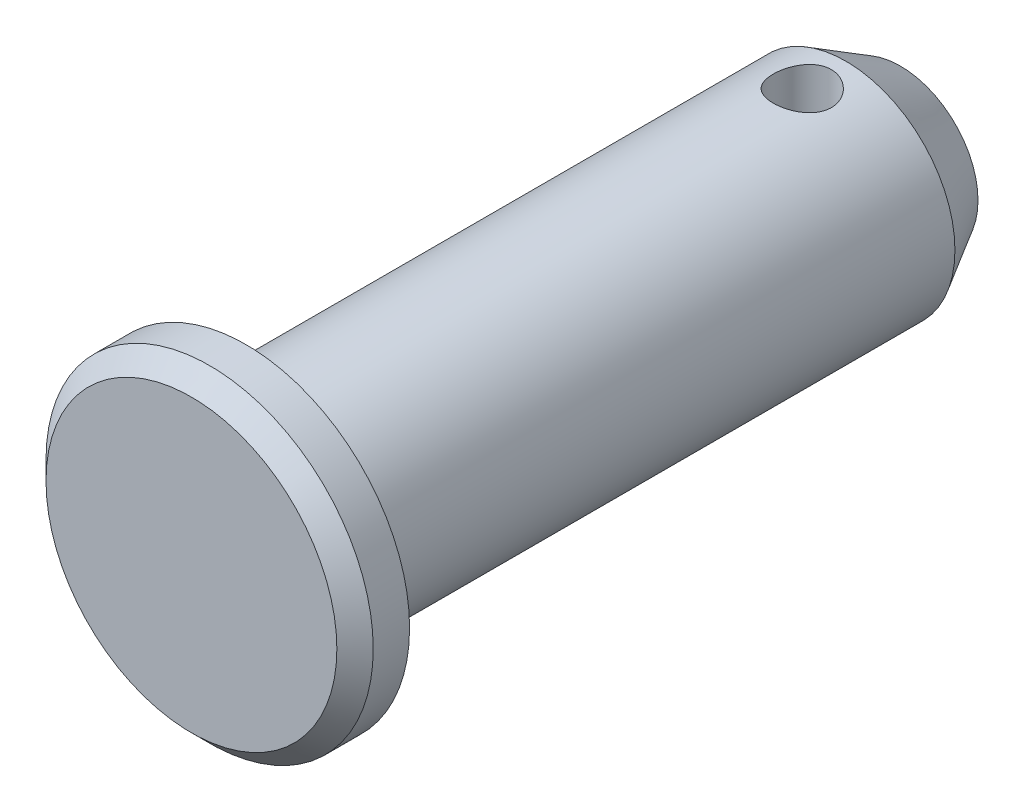
ISO-10303-21;
HEADER;
FILE_DESCRIPTION(('STEP AP214'),'2;1');
FILE_NAME('part.step','',(''),(''),'','','');
FILE_SCHEMA(('AUTOMOTIVE_DESIGN { 1 0 10303 214 1 1 1 1 }'));
ENDSEC;
DATA;
#1=APPLICATION_CONTEXT('core data for automotive mechanical design processes');
#2=APPLICATION_PROTOCOL_DEFINITION('international standard','automotive_design',2000,#1);
#3=PRODUCT_CONTEXT('',#1,'mechanical');
#4=PRODUCT('Part','Part','',(#3));
#5=PRODUCT_RELATED_PRODUCT_CATEGORY('part','',(#4));
#6=PRODUCT_DEFINITION_FORMATION('','',#4);
#7=PRODUCT_DEFINITION_CONTEXT('part definition',#1,'design');
#8=PRODUCT_DEFINITION('design','',#6,#7);
#9=PRODUCT_DEFINITION_SHAPE('','',#8);
#10=(LENGTH_UNIT() NAMED_UNIT(*) SI_UNIT(.MILLI.,.METRE.));
#11=(NAMED_UNIT(*) PLANE_ANGLE_UNIT() SI_UNIT($,.RADIAN.));
#12=(NAMED_UNIT(*) SI_UNIT($,.STERADIAN.) SOLID_ANGLE_UNIT());
#13=UNCERTAINTY_MEASURE_WITH_UNIT(LENGTH_MEASURE(1.E-05),#10,'distance_accuracy_value','');
#14=(GEOMETRIC_REPRESENTATION_CONTEXT(3) GLOBAL_UNCERTAINTY_ASSIGNED_CONTEXT((#13)) GLOBAL_UNIT_ASSIGNED_CONTEXT((#10,
#11,#12)) REPRESENTATION_CONTEXT('',''));
#15=CARTESIAN_POINT('',(0.,0.,0.));
#16=DIRECTION('',(0.,0.,1.));
#17=DIRECTION('',(1.,0.,0.));
#18=AXIS2_PLACEMENT_3D('',#15,#16,#17);
#19=CARTESIAN_POINT('',(0.,0.,9.75));
#20=DIRECTION('',(0.,0.,-1.));
#21=DIRECTION('',(-1.,0.,0.));
#22=AXIS2_PLACEMENT_3D('',#19,#20,#21);
#23=PLANE('',#22);
#24=CARTESIAN_POINT('',(0.,0.,9.75));
#25=DIRECTION('',(0.,0.,1.));
#26=DIRECTION('',(1.,0.,0.));
#27=AXIS2_PLACEMENT_3D('',#24,#25,#26);
#28=CIRCLE('',#27,4.);
#29=CARTESIAN_POINT('',(4.,0.,9.75));
#30=VERTEX_POINT('',#29);
#31=EDGE_CURVE('E10',#30,#30,#28,.T.);
#32=ORIENTED_EDGE('',*,*,#31,.T.);
#33=EDGE_LOOP('',(#32));
#34=FACE_BOUND('',#33,.T.);
#35=ADVANCED_FACE('F33',(#34),#23,.F.);
#36=CARTESIAN_POINT('',(0.,0.,9.25));
#37=DIRECTION('',(0.,0.,-1.));
#38=DIRECTION('',(-1.,0.,0.));
#39=AXIS2_PLACEMENT_3D('',#36,#37,#38);
#40=CONICAL_SURFACE('',#39,4.5,0.785398163397446);
#41=ORIENTED_EDGE('',*,*,#31,.F.);
#42=EDGE_LOOP('',(#41));
#43=FACE_BOUND('',#42,.T.);
#44=CARTESIAN_POINT('',(0.,0.,9.25));
#45=DIRECTION('',(0.,0.,1.));
#46=DIRECTION('',(1.,0.,0.));
#47=AXIS2_PLACEMENT_3D('',#44,#45,#46);
#48=CIRCLE('',#47,4.5);
#49=CARTESIAN_POINT('',(4.5,0.,9.25));
#50=VERTEX_POINT('',#49);
#51=EDGE_CURVE('E45',#50,#50,#48,.T.);
#52=ORIENTED_EDGE('',*,*,#51,.T.);
#53=EDGE_LOOP('',(#52));
#54=FACE_BOUND('',#53,.T.);
#55=ADVANCED_FACE('F82',(#43,#54),#40,.T.);
#56=CARTESIAN_POINT('',(0.,0.,9.75));
#57=DIRECTION('',(0.,0.,1.));
#58=DIRECTION('',(1.,0.,0.));
#59=AXIS2_PLACEMENT_3D('',#56,#57,#58);
#60=CYLINDRICAL_SURFACE('',#59,4.5);
#61=ORIENTED_EDGE('',*,*,#51,.F.);
#62=EDGE_LOOP('',(#61));
#63=FACE_BOUND('',#62,.T.);
#64=CARTESIAN_POINT('',(0.,0.,8.25));
#65=DIRECTION('',(0.,0.,1.));
#66=DIRECTION('',(1.,0.,0.));
#67=AXIS2_PLACEMENT_3D('',#64,#65,#66);
#68=CIRCLE('',#67,4.5);
#69=CARTESIAN_POINT('',(4.5,0.,8.25));
#70=VERTEX_POINT('',#69);
#71=EDGE_CURVE('E50',#70,#70,#68,.T.);
#72=ORIENTED_EDGE('',*,*,#71,.T.);
#73=EDGE_LOOP('',(#72));
#74=FACE_BOUND('',#73,.T.);
#75=ADVANCED_FACE('F86',(#63,#74),#60,.T.);
#76=CARTESIAN_POINT('',(0.,0.,8.25));
#77=DIRECTION('',(0.,0.,1.));
#78=DIRECTION('',(1.,0.,0.));
#79=AXIS2_PLACEMENT_3D('',#76,#77,#78);
#80=PLANE('',#79);
#81=ORIENTED_EDGE('',*,*,#71,.F.);
#82=EDGE_LOOP('',(#81));
#83=FACE_BOUND('',#82,.T.);
#84=CARTESIAN_POINT('',(0.,0.,8.25));
#85=DIRECTION('',(0.,0.,1.));
#86=DIRECTION('',(1.,0.,0.));
#87=AXIS2_PLACEMENT_3D('',#84,#85,#86);
#88=CIRCLE('',#87,3.);
#89=CARTESIAN_POINT('',(3.,0.,8.25));
#90=VERTEX_POINT('',#89);
#91=EDGE_CURVE('E103',#90,#90,#88,.T.);
#92=ORIENTED_EDGE('',*,*,#91,.T.);
#93=EDGE_LOOP('',(#92));
#94=FACE_BOUND('',#93,.T.);
#95=ADVANCED_FACE('F77',(#83,#94),#80,.F.);
#96=CARTESIAN_POINT('',(0.,0.,9.75));
#97=DIRECTION('',(0.,0.,1.));
#98=DIRECTION('',(1.,0.,0.));
#99=AXIS2_PLACEMENT_3D('',#96,#97,#98);
#100=CYLINDRICAL_SURFACE('',#99,3.);
#101=CARTESIAN_POINT('',(0.,-3.,-6.25));
#102=CARTESIAN_POINT('',(0.0441018223331417,-2.99999933524065,-6.25000104677394));
#103=CARTESIAN_POINT('',(0.0882148640887362,-2.99901794464862,-6.25365904567587));
#104=CARTESIAN_POINT('',(0.175170180541785,-2.99519829448663,-6.26816849229548));
#105=CARTESIAN_POINT('',(0.218011833327634,-2.9923591413303,-6.27902340177044));
#106=CARTESIAN_POINT('',(0.301156635618125,-2.98513733301121,-6.30754866674561));
#107=CARTESIAN_POINT('',(0.341462980406115,-2.98075666852169,-6.32521023506641));
#108=CARTESIAN_POINT('',(0.418541474557063,-2.97091479660652,-6.36681489706664));
#109=CARTESIAN_POINT('',(0.455313388179847,-2.96545351718002,-6.39075840934369));
#110=CARTESIAN_POINT('',(0.525131801496009,-2.95389845960869,-6.44483340656537));
#111=CARTESIAN_POINT('',(0.558084675945126,-2.9477938707174,-6.47508346720339));
#112=CARTESIAN_POINT('',(0.61851485464254,-2.93570963871569,-6.54065939322526));
#113=CARTESIAN_POINT('',(0.645991453982616,-2.92973001177899,-6.5759859110467));
#114=CARTESIAN_POINT('',(0.695145636973703,-2.91846214986765,-6.6514592939305));
#115=CARTESIAN_POINT('',(0.716715510946109,-2.91318755429117,-6.69167853130589));
#116=CARTESIAN_POINT('',(0.752750192307817,-2.90408590923454,-6.77533604443577));
#117=CARTESIAN_POINT('',(0.767216309804881,-2.9002585928704,-6.81877372492809));
#118=CARTESIAN_POINT('',(0.788307680905701,-2.89459646334927,-6.90659821513066));
#119=CARTESIAN_POINT('',(0.795102680979745,-2.89271859176123,-6.95094141598086));
#120=CARTESIAN_POINT('',(0.80118813882437,-2.89103932417876,-7.04017507333317));
#121=CARTESIAN_POINT('',(0.800479998822944,-2.89123754019361,-7.08506542601425));
#122=CARTESIAN_POINT('',(0.791714040010484,-2.89364951507618,-7.17279416614895));
#123=CARTESIAN_POINT('',(0.783861624258975,-2.89580694201076,-7.21565487281521));
#124=CARTESIAN_POINT('',(0.761358994888816,-2.90180405235812,-7.29942733378268));
#125=CARTESIAN_POINT('',(0.746708237972002,-2.90564387021998,-7.34033893203019));
#126=CARTESIAN_POINT('',(0.710857427861001,-2.91462264698391,-7.41958725752338));
#127=CARTESIAN_POINT('',(0.689585364551132,-2.91977577127223,-7.45788973571449));
#128=CARTESIAN_POINT('',(0.641146015295117,-2.93079291857236,-7.53045366354062));
#129=CARTESIAN_POINT('',(0.613977568897007,-2.93665708142145,-7.56471431566259));
#130=CARTESIAN_POINT('',(0.553466429053674,-2.94867004251873,-7.62939559898192));
#131=CARTESIAN_POINT('',(0.519951250913196,-2.95482188595513,-7.65965452732598));
#132=CARTESIAN_POINT('',(0.44824706728255,-2.96654552510546,-7.71415551214012));
#133=CARTESIAN_POINT('',(0.410057877682036,-2.97211729795427,-7.73839733148097));
#134=CARTESIAN_POINT('',(0.329839302198981,-2.98208728159312,-7.78024716112986));
#135=CARTESIAN_POINT('',(0.287793961020716,-2.98648029133423,-7.79782590817944));
#136=CARTESIAN_POINT('',(0.201200917756158,-2.99356017760401,-7.82561887552535));
#137=CARTESIAN_POINT('',(0.15665376477133,-2.996247426935,-7.83583470508959));
#138=CARTESIAN_POINT('',(0.0677016332582059,-2.99955663423354,-7.84835795076713));
#139=CARTESIAN_POINT('',(0.0233296950565518,-3.00023598988385,-7.85088521594035));
#140=CARTESIAN_POINT('',(-0.0652040183604792,-2.99961788676677,-7.84856673430122));
#141=CARTESIAN_POINT('',(-0.109365814824844,-2.99832063232137,-7.8437217495577));
#142=CARTESIAN_POINT('',(-0.195440979960713,-2.99393214198412,-7.82697662101601));
#143=CARTESIAN_POINT('',(-0.237379940811116,-2.99087210618547,-7.81519910152089));
#144=CARTESIAN_POINT('',(-0.318682788470423,-2.98330517957641,-7.78506562219683));
#145=CARTESIAN_POINT('',(-0.358046395686399,-2.9787981319841,-7.76670894949982));
#146=CARTESIAN_POINT('',(-0.433935389867193,-2.96870264223867,-7.72353044512775));
#147=CARTESIAN_POINT('',(-0.47039007538452,-2.96309474642193,-7.69858901328077));
#148=CARTESIAN_POINT('',(-0.538673854158812,-2.95144580946015,-7.64309934793694));
#149=CARTESIAN_POINT('',(-0.570502031519497,-2.94540468290222,-7.61255000696009));
#150=CARTESIAN_POINT('',(-0.629555697915275,-2.9333589834749,-7.54568576900165));
#151=CARTESIAN_POINT('',(-0.656626076999944,-2.92736024574782,-7.50923257543994));
#152=CARTESIAN_POINT('',(-0.704268764739794,-2.91626578870035,-7.43217412156214));
#153=CARTESIAN_POINT('',(-0.724841344486107,-2.91117003171109,-7.39156903455851));
#154=CARTESIAN_POINT('',(-0.758749646345944,-2.9025170736066,-7.30756187716472));
#155=CARTESIAN_POINT('',(-0.77212724902359,-2.89895099369493,-7.26417767525075));
#156=CARTESIAN_POINT('',(-0.791364820483172,-2.89375930092876,-7.17566427210647));
#157=CARTESIAN_POINT('',(-0.797226710411952,-2.89213319219128,-7.13053551985317));
#158=CARTESIAN_POINT('',(-0.801155958613012,-2.89104697818674,-7.04140208485098));
#159=CARTESIAN_POINT('',(-0.799472622471941,-2.89151759094413,-6.99740907189789));
#160=CARTESIAN_POINT('',(-0.78893750400225,-2.89440958435318,-6.91035859439478));
#161=CARTESIAN_POINT('',(-0.780085906140234,-2.89683091480545,-6.86730110579945));
#162=CARTESIAN_POINT('',(-0.755610062798666,-2.903310284285,-6.78365769914838));
#163=CARTESIAN_POINT('',(-0.740038644302285,-2.90735554007653,-6.74305526290721));
#164=CARTESIAN_POINT('',(-0.702606218249579,-2.91662727254676,-6.66500846778626));
#165=CARTESIAN_POINT('',(-0.680744224098476,-2.92185393448601,-6.62756460547978));
#166=CARTESIAN_POINT('',(-0.630595637075258,-2.93309168576127,-6.55570785620138));
#167=CARTESIAN_POINT('',(-0.602138919071635,-2.93912133240661,-6.52141658600952));
#168=CARTESIAN_POINT('',(-0.539932214044403,-2.95118201513218,-6.45801501933306));
#169=CARTESIAN_POINT('',(-0.506180941743499,-2.95721305119381,-6.42890598453246));
#170=CARTESIAN_POINT('',(-0.433471992435473,-2.96875124961583,-6.37608310494126));
#171=CARTESIAN_POINT('',(-0.394418384700712,-2.97424444525819,-6.35249799574027));
#172=CARTESIAN_POINT('',(-0.312755456166756,-2.9839352404116,-6.31226503362825));
#173=CARTESIAN_POINT('',(-0.270148437878519,-2.98813367073438,-6.29561272973456));
#174=CARTESIAN_POINT('',(-0.189749881952396,-2.99421901005387,-6.27188988583379));
#175=CARTESIAN_POINT('',(-0.152304806626014,-2.99637108237041,-6.263700246563));
#176=CARTESIAN_POINT('',(-0.0765759181268305,-2.99926179614582,-6.25275511753318));
#177=CARTESIAN_POINT('',(-0.0382921881619441,-3.00000057718908,-6.24999909111999));
#178=CARTESIAN_POINT('',(0.,-3.,-6.25));
#179=B_SPLINE_CURVE_WITH_KNOTS('',3,(#101,#102,#103,#104,#105,#106,#107,#108,#109,#110,#111,
#112,#113,#114,#115,#116,#117,#118,#119,#120,#121,#122,#123,#124,#125,#126,#127,#128,#129,#130,
#131,#132,#133,#134,#135,#136,#137,#138,#139,#140,#141,#142,#143,#144,#145,#146,#147,#148,#149,
#150,#151,#152,#153,#154,#155,#156,#157,#158,#159,#160,#161,#162,#163,#164,#165,#166,#167,#168,
#169,#170,#171,#172,#173,#174,#175,#176,#177,#178),.UNSPECIFIED.,.T.,.F.,(4,2,2,2,2,2,2,2,2,2,2,
2,2,2,2,2,2,2,2,2,2,2,2,2,2,2,2,2,2,2,2,2,2,2,2,2,2,2,4),(0.,0.132165039579827,0.26439369750458,
0.396452221188773,0.528519546834701,0.663339591819867,0.798176979700596,0.935330330092918,
1.0724583765188,1.20648863299035,1.34049384159394,1.47076400816064,1.60104458722842,
1.73279469336265,1.86457075244718,2.00064503922595,2.13672468772705,2.27339523838882,
2.41003590873721,2.54273087007485,2.67541211567806,2.80581414254512,2.93623030307912,
3.06920114399486,3.20219827301221,3.33894598550781,3.47568799207309,3.61162519076595,
3.74752763461531,3.87897336957382,4.01041572204175,4.14084306175259,4.27129086845139,
4.40557735824493,4.53989649728917,4.67708900908297,4.8141933045401,4.92895927593272,
5.04371391182491),.UNSPECIFIED.);
#180=CARTESIAN_POINT('',(0.,-3.,-6.25));
#181=VERTEX_POINT('',#180);
#182=EDGE_CURVE('E36',#181,#181,#179,.T.);
#183=ORIENTED_EDGE('',*,*,#182,.T.);
#184=EDGE_LOOP('',(#183));
#185=FACE_BOUND('',#184,.T.);
#186=CARTESIAN_POINT('',(0.,3.,-6.25));
#187=CARTESIAN_POINT('',(-0.0441018223331416,2.99999933524065,-6.25000104677394));
#188=CARTESIAN_POINT('',(-0.0882148640887361,2.99901794464862,-6.25365904567587));
#189=CARTESIAN_POINT('',(-0.175170180541785,2.99519829448663,-6.26816849229548));
#190=CARTESIAN_POINT('',(-0.218011833327634,2.9923591413303,-6.27902340177044));
#191=CARTESIAN_POINT('',(-0.301156635618125,2.98513733301121,-6.30754866674561));
#192=CARTESIAN_POINT('',(-0.341462980406115,2.98075666852169,-6.32521023506641));
#193=CARTESIAN_POINT('',(-0.418541474557063,2.97091479660653,-6.36681489706664));
#194=CARTESIAN_POINT('',(-0.455313388179847,2.96545351718003,-6.39075840934369));
#195=CARTESIAN_POINT('',(-0.525131801496009,2.95389845960869,-6.44483340656537));
#196=CARTESIAN_POINT('',(-0.558084675945125,2.9477938707174,-6.47508346720339));
#197=CARTESIAN_POINT('',(-0.618514854642539,2.93570963871569,-6.54065939322526));
#198=CARTESIAN_POINT('',(-0.645991453982616,2.92973001177899,-6.5759859110467));
#199=CARTESIAN_POINT('',(-0.695145636973703,2.91846214986765,-6.6514592939305));
#200=CARTESIAN_POINT('',(-0.716715510946109,2.91318755429117,-6.69167853130589));
#201=CARTESIAN_POINT('',(-0.752750192307817,2.90408590923454,-6.77533604443577));
#202=CARTESIAN_POINT('',(-0.767216309804881,2.9002585928704,-6.81877372492809));
#203=CARTESIAN_POINT('',(-0.788307680905701,2.89459646334927,-6.90659821513066));
#204=CARTESIAN_POINT('',(-0.795102680979745,2.89271859176123,-6.95094141598086));
#205=CARTESIAN_POINT('',(-0.80118813882437,2.89103932417876,-7.04017507333317));
#206=CARTESIAN_POINT('',(-0.800479998822944,2.89123754019361,-7.08506542601425));
#207=CARTESIAN_POINT('',(-0.791714040010484,2.89364951507619,-7.17279416614895));
#208=CARTESIAN_POINT('',(-0.783861624258975,2.89580694201076,-7.21565487281521));
#209=CARTESIAN_POINT('',(-0.761358994888816,2.90180405235812,-7.29942733378268));
#210=CARTESIAN_POINT('',(-0.746708237972002,2.90564387021998,-7.34033893203019));
#211=CARTESIAN_POINT('',(-0.710857427861001,2.91462264698391,-7.41958725752338));
#212=CARTESIAN_POINT('',(-0.689585364551132,2.91977577127223,-7.45788973571449));
#213=CARTESIAN_POINT('',(-0.641146015295117,2.93079291857237,-7.53045366354062));
#214=CARTESIAN_POINT('',(-0.613977568897007,2.93665708142145,-7.56471431566259));
#215=CARTESIAN_POINT('',(-0.553466429053674,2.94867004251873,-7.62939559898192));
#216=CARTESIAN_POINT('',(-0.519951250913196,2.95482188595513,-7.65965452732598));
#217=CARTESIAN_POINT('',(-0.448247067282549,2.96654552510546,-7.71415551214012));
#218=CARTESIAN_POINT('',(-0.410057877682036,2.97211729795427,-7.73839733148097));
#219=CARTESIAN_POINT('',(-0.329839302198981,2.98208728159312,-7.78024716112986));
#220=CARTESIAN_POINT('',(-0.287793961020716,2.98648029133423,-7.79782590817944));
#221=CARTESIAN_POINT('',(-0.201200917756158,2.99356017760401,-7.82561887552535));
#222=CARTESIAN_POINT('',(-0.156653764771329,2.996247426935,-7.83583470508959));
#223=CARTESIAN_POINT('',(-0.0677016332582057,2.99955663423354,-7.84835795076713));
#224=CARTESIAN_POINT('',(-0.0233296950565515,3.00023598988385,-7.85088521594035));
#225=CARTESIAN_POINT('',(0.0652040183604795,2.99961788676677,-7.84856673430122));
#226=CARTESIAN_POINT('',(0.109365814824845,2.99832063232137,-7.8437217495577));
#227=CARTESIAN_POINT('',(0.195440979960713,2.99393214198412,-7.82697662101601));
#228=CARTESIAN_POINT('',(0.237379940811116,2.99087210618547,-7.81519910152089));
#229=CARTESIAN_POINT('',(0.318682788470423,2.98330517957641,-7.78506562219683));
#230=CARTESIAN_POINT('',(0.358046395686399,2.9787981319841,-7.76670894949982));
#231=CARTESIAN_POINT('',(0.433935389867193,2.96870264223867,-7.72353044512775));
#232=CARTESIAN_POINT('',(0.47039007538452,2.96309474642193,-7.69858901328077));
#233=CARTESIAN_POINT('',(0.538673854158812,2.95144580946015,-7.64309934793694));
#234=CARTESIAN_POINT('',(0.570502031519497,2.94540468290222,-7.61255000696009));
#235=CARTESIAN_POINT('',(0.629555697915275,2.9333589834749,-7.54568576900165));
#236=CARTESIAN_POINT('',(0.656626076999944,2.92736024574781,-7.50923257543994));
#237=CARTESIAN_POINT('',(0.704268764739795,2.91626578870035,-7.43217412156214));
#238=CARTESIAN_POINT('',(0.724841344486108,2.91117003171109,-7.39156903455851));
#239=CARTESIAN_POINT('',(0.758749646345945,2.9025170736066,-7.30756187716472));
#240=CARTESIAN_POINT('',(0.77212724902359,2.89895099369493,-7.26417767525075));
#241=CARTESIAN_POINT('',(0.791364820483173,2.89375930092876,-7.17566427210647));
#242=CARTESIAN_POINT('',(0.797226710411952,2.89213319219128,-7.13053551985317));
#243=CARTESIAN_POINT('',(0.801155958613012,2.89104697818674,-7.04140208485098));
#244=CARTESIAN_POINT('',(0.799472622471941,2.89151759094413,-6.99740907189789));
#245=CARTESIAN_POINT('',(0.78893750400225,2.89440958435318,-6.91035859439478));
#246=CARTESIAN_POINT('',(0.780085906140234,2.89683091480545,-6.86730110579945));
#247=CARTESIAN_POINT('',(0.755610062798666,2.903310284285,-6.78365769914838));
#248=CARTESIAN_POINT('',(0.740038644302285,2.90735554007653,-6.74305526290721));
#249=CARTESIAN_POINT('',(0.702606218249579,2.91662727254676,-6.66500846778626));
#250=CARTESIAN_POINT('',(0.680744224098476,2.92185393448601,-6.62756460547978));
#251=CARTESIAN_POINT('',(0.630595637075258,2.93309168576127,-6.55570785620138));
#252=CARTESIAN_POINT('',(0.602138919071635,2.93912133240661,-6.52141658600952));
#253=CARTESIAN_POINT('',(0.539932214044403,2.95118201513218,-6.45801501933306));
#254=CARTESIAN_POINT('',(0.506180941743499,2.95721305119381,-6.42890598453246));
#255=CARTESIAN_POINT('',(0.433471992435473,2.96875124961583,-6.37608310494126));
#256=CARTESIAN_POINT('',(0.394418384700711,2.97424444525819,-6.35249799574027));
#257=CARTESIAN_POINT('',(0.312755456166756,2.9839352404116,-6.31226503362825));
#258=CARTESIAN_POINT('',(0.270148437878518,2.98813367073438,-6.29561272973456));
#259=CARTESIAN_POINT('',(0.189749881952396,2.99421901005387,-6.27188988583379));
#260=CARTESIAN_POINT('',(0.152304806626014,2.99637108237041,-6.263700246563));
#261=CARTESIAN_POINT('',(0.0765759181268307,2.99926179614582,-6.25275511753318));
#262=CARTESIAN_POINT('',(0.0382921881619442,3.00000057718908,-6.24999909111999));
#263=CARTESIAN_POINT('',(0.,3.,-6.25));
#264=B_SPLINE_CURVE_WITH_KNOTS('',3,(#186,#187,#188,#189,#190,#191,#192,#193,#194,#195,#196,
#197,#198,#199,#200,#201,#202,#203,#204,#205,#206,#207,#208,#209,#210,#211,#212,#213,#214,#215,
#216,#217,#218,#219,#220,#221,#222,#223,#224,#225,#226,#227,#228,#229,#230,#231,#232,#233,#234,
#235,#236,#237,#238,#239,#240,#241,#242,#243,#244,#245,#246,#247,#248,#249,#250,#251,#252,#253,
#254,#255,#256,#257,#258,#259,#260,#261,#262,#263),.UNSPECIFIED.,.T.,.F.,(4,2,2,2,2,2,2,2,2,2,2,
2,2,2,2,2,2,2,2,2,2,2,2,2,2,2,2,2,2,2,2,2,2,2,2,2,2,2,4),(0.,0.132165039579827,0.26439369750458,
0.396452221188773,0.528519546834701,0.663339591819867,0.798176979700596,0.935330330092918,
1.0724583765188,1.20648863299036,1.34049384159394,1.47076400816064,1.60104458722842,
1.73279469336265,1.86457075244718,2.00064503922595,2.13672468772705,2.27339523838882,
2.41003590873721,2.54273087007485,2.67541211567806,2.80581414254512,2.93623030307912,
3.06920114399486,3.20219827301221,3.33894598550781,3.47568799207309,3.61162519076595,
3.74752763461531,3.87897336957382,4.01041572204175,4.14084306175259,4.27129086845139,
4.40557735824493,4.53989649728917,4.67708900908297,4.8141933045401,4.92895927593272,
5.04371391182491),.UNSPECIFIED.);
#265=CARTESIAN_POINT('',(0.,3.,-6.25));
#266=VERTEX_POINT('',#265);
#267=EDGE_CURVE('E53',#266,#266,#264,.T.);
#268=ORIENTED_EDGE('',*,*,#267,.T.);
#269=EDGE_LOOP('',(#268));
#270=FACE_BOUND('',#269,.T.);
#271=ORIENTED_EDGE('',*,*,#91,.F.);
#272=EDGE_LOOP('',(#271));
#273=FACE_BOUND('',#272,.T.);
#274=CARTESIAN_POINT('',(0.,0.,-8.25));
#275=DIRECTION('',(0.,0.,1.));
#276=DIRECTION('',(1.,0.,0.));
#277=AXIS2_PLACEMENT_3D('',#274,#275,#276);
#278=CIRCLE('',#277,3.);
#279=CARTESIAN_POINT('',(3.,0.,-8.25));
#280=VERTEX_POINT('',#279);
#281=EDGE_CURVE('E105',#280,#280,#278,.T.);
#282=ORIENTED_EDGE('',*,*,#281,.T.);
#283=EDGE_LOOP('',(#282));
#284=FACE_BOUND('',#283,.T.);
#285=ADVANCED_FACE('F58',(#185,#270,#273,#284),#100,.T.);
#286=CARTESIAN_POINT('',(0.,0.,-9.75));
#287=DIRECTION('',(0.,0.,1.));
#288=DIRECTION('',(1.,0.,0.));
#289=AXIS2_PLACEMENT_3D('',#286,#287,#288);
#290=CONICAL_SURFACE('',#289,2.13397459621557,0.523598775598299);
#291=ORIENTED_EDGE('',*,*,#281,.F.);
#292=EDGE_LOOP('',(#291));
#293=FACE_BOUND('',#292,.T.);
#294=CARTESIAN_POINT('',(0.,0.,-9.75));
#295=DIRECTION('',(0.,0.,1.));
#296=DIRECTION('',(1.,0.,0.));
#297=AXIS2_PLACEMENT_3D('',#294,#295,#296);
#298=CIRCLE('',#297,2.13397459621557);
#299=CARTESIAN_POINT('',(2.13397459621556,0.,-9.75));
#300=VERTEX_POINT('',#299);
#301=EDGE_CURVE('E108',#300,#300,#298,.T.);
#302=ORIENTED_EDGE('',*,*,#301,.T.);
#303=EDGE_LOOP('',(#302));
#304=FACE_BOUND('',#303,.T.);
#305=ADVANCED_FACE('F70',(#293,#304),#290,.T.);
#306=CARTESIAN_POINT('',(0.,0.,-9.75));
#307=DIRECTION('',(0.,0.,1.));
#308=DIRECTION('',(1.,0.,0.));
#309=AXIS2_PLACEMENT_3D('',#306,#307,#308);
#310=PLANE('',#309);
#311=ORIENTED_EDGE('',*,*,#301,.F.);
#312=EDGE_LOOP('',(#311));
#313=FACE_BOUND('',#312,.T.);
#314=ADVANCED_FACE('F66',(#313),#310,.F.);
#315=CARTESIAN_POINT('',(0.,-4.5,-7.05));
#316=DIRECTION('',(0.,1.,0.));
#317=DIRECTION('',(0.,0.,1.));
#318=AXIS2_PLACEMENT_3D('',#315,#316,#317);
#319=CYLINDRICAL_SURFACE('',#318,0.8);
#320=ORIENTED_EDGE('',*,*,#267,.F.);
#321=EDGE_LOOP('',(#320));
#322=FACE_BOUND('',#321,.T.);
#323=ORIENTED_EDGE('',*,*,#182,.F.);
#324=EDGE_LOOP('',(#323));
#325=FACE_BOUND('',#324,.T.);
#326=ADVANCED_FACE('F62',(#322,#325),#319,.F.);
#327=CLOSED_SHELL('',(#35,#55,#75,#95,#285,#305,#314,#326));
#328=MANIFOLD_SOLID_BREP('B2',#327);
#329=ADVANCED_BREP_SHAPE_REPRESENTATION('',(#18,#328),#14);
#330=SHAPE_DEFINITION_REPRESENTATION(#9,#329);
ENDSEC;
END-ISO-10303-21;
